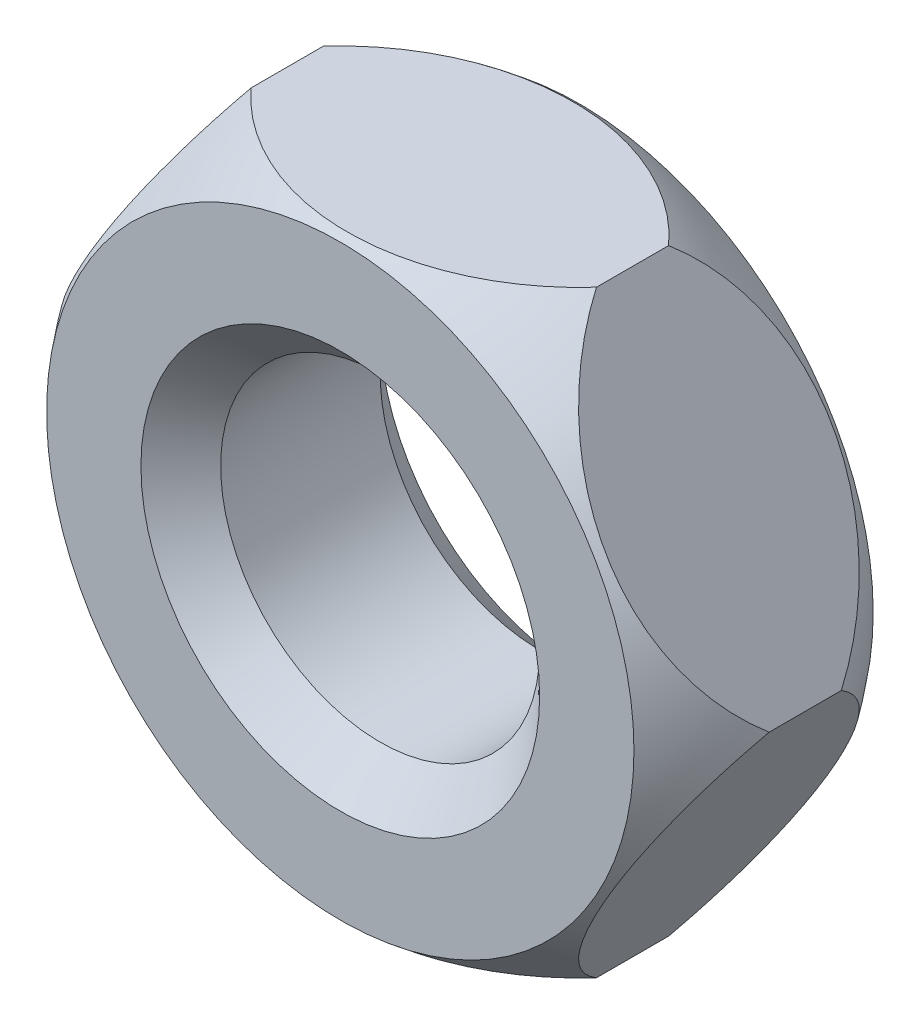
ISO-10303-21;
HEADER;
FILE_DESCRIPTION(('STEP AP214'),'2;1');
FILE_NAME('part.step','',(''),(''),'','','');
FILE_SCHEMA(('AUTOMOTIVE_DESIGN { 1 0 10303 214 1 1 1 1 }'));
ENDSEC;
DATA;
#1=APPLICATION_CONTEXT('core data for automotive mechanical design processes');
#2=APPLICATION_PROTOCOL_DEFINITION('international standard','automotive_design',2000,#1);
#3=PRODUCT_CONTEXT('',#1,'mechanical');
#4=PRODUCT('Part','Part','',(#3));
#5=PRODUCT_RELATED_PRODUCT_CATEGORY('part','',(#4));
#6=PRODUCT_DEFINITION_FORMATION('','',#4);
#7=PRODUCT_DEFINITION_CONTEXT('part definition',#1,'design');
#8=PRODUCT_DEFINITION('design','',#6,#7);
#9=PRODUCT_DEFINITION_SHAPE('','',#8);
#10=(LENGTH_UNIT() NAMED_UNIT(*) SI_UNIT(.MILLI.,.METRE.));
#11=(NAMED_UNIT(*) PLANE_ANGLE_UNIT() SI_UNIT($,.RADIAN.));
#12=(NAMED_UNIT(*) SI_UNIT($,.STERADIAN.) SOLID_ANGLE_UNIT());
#13=UNCERTAINTY_MEASURE_WITH_UNIT(LENGTH_MEASURE(1.E-05),#10,'distance_accuracy_value','');
#14=(GEOMETRIC_REPRESENTATION_CONTEXT(3) GLOBAL_UNCERTAINTY_ASSIGNED_CONTEXT((#13)) GLOBAL_UNIT_ASSIGNED_CONTEXT((#10,
#11,#12)) REPRESENTATION_CONTEXT('',''));
#15=CARTESIAN_POINT('',(0.,0.,0.));
#16=DIRECTION('',(0.,0.,1.));
#17=DIRECTION('',(1.,0.,0.));
#18=AXIS2_PLACEMENT_3D('',#15,#16,#17);
#19=CARTESIAN_POINT('',(0.,0.,0.));
#20=DIRECTION('',(0.,0.,1.));
#21=DIRECTION('',(1.,0.,0.));
#22=AXIS2_PLACEMENT_3D('',#19,#20,#21);
#23=PLANE('',#22);
#24=CARTESIAN_POINT('',(0.,0.,0.));
#25=DIRECTION('',(0.,0.,1.));
#26=DIRECTION('',(1.,0.,0.));
#27=AXIS2_PLACEMENT_3D('',#24,#25,#26);
#28=CIRCLE('',#27,2.5);
#29=CARTESIAN_POINT('',(2.5,0.,0.));
#30=VERTEX_POINT('',#29);
#31=EDGE_CURVE('E142',#30,#30,#28,.T.);
#32=ORIENTED_EDGE('',*,*,#31,.T.);
#33=EDGE_LOOP('',(#32));
#34=FACE_BOUND('',#33,.T.);
#35=CARTESIAN_POINT('',(0.,0.,0.));
#36=DIRECTION('',(0.,0.,1.));
#37=DIRECTION('',(1.,0.,0.));
#38=AXIS2_PLACEMENT_3D('',#35,#36,#37);
#39=CIRCLE('',#38,3.68272996566406);
#40=CARTESIAN_POINT('',(3.68272996566406,0.,0.));
#41=VERTEX_POINT('',#40);
#42=EDGE_CURVE('E167',#41,#41,#39,.F.);
#43=ORIENTED_EDGE('',*,*,#42,.T.);
#44=EDGE_LOOP('',(#43));
#45=FACE_BOUND('',#44,.T.);
#46=ADVANCED_FACE('F41',(#34,#45),#23,.F.);
#47=CARTESIAN_POINT('',(0.,0.,3.));
#48=DIRECTION('',(0.,0.,1.));
#49=DIRECTION('',(1.,0.,0.));
#50=AXIS2_PLACEMENT_3D('',#47,#48,#49);
#51=PLANE('',#50);
#52=CARTESIAN_POINT('',(0.,0.,3.));
#53=DIRECTION('',(0.,0.,1.));
#54=DIRECTION('',(1.,0.,0.));
#55=AXIS2_PLACEMENT_3D('',#52,#53,#54);
#56=CIRCLE('',#55,2.5);
#57=CARTESIAN_POINT('',(2.5,0.,3.));
#58=VERTEX_POINT('',#57);
#59=EDGE_CURVE('E11',#58,#58,#56,.F.);
#60=ORIENTED_EDGE('',*,*,#59,.T.);
#61=EDGE_LOOP('',(#60));
#62=FACE_BOUND('',#61,.T.);
#63=CARTESIAN_POINT('',(0.,0.,3.));
#64=DIRECTION('',(0.,0.,1.));
#65=DIRECTION('',(1.,0.,0.));
#66=AXIS2_PLACEMENT_3D('',#63,#64,#65);
#67=CIRCLE('',#66,3.68272996566406);
#68=CARTESIAN_POINT('',(3.68272996566406,0.,3.));
#69=VERTEX_POINT('',#68);
#70=EDGE_CURVE('E192',#69,#69,#67,.F.);
#71=ORIENTED_EDGE('',*,*,#70,.F.);
#72=EDGE_LOOP('',(#71));
#73=FACE_BOUND('',#72,.T.);
#74=ADVANCED_FACE('F163',(#62,#73),#51,.T.);
#75=CARTESIAN_POINT('',(2.1650635094611,-3.75,3.));
#76=DIRECTION('',(-0.866025403784439,0.5,0.));
#77=DIRECTION('',(-0.5,-0.866025403784439,0.));
#78=AXIS2_PLACEMENT_3D('',#75,#76,#77);
#79=PLANE('',#78);
#80=DIRECTION('',(0.,0.,-1.));
#81=VECTOR('',#80,1.);
#82=CARTESIAN_POINT('',(2.1650635094611,-3.75,3.));
#83=LINE('',#82,#81);
#84=CARTESIAN_POINT('',(2.16506350946109,-3.75,1.95256241897666));
#85=VERTEX_POINT('',#84);
#86=CARTESIAN_POINT('',(2.1650635094611,-3.75,1.04743758102334));
#87=VERTEX_POINT('',#86);
#88=EDGE_CURVE('E126',#85,#87,#83,.T.);
#89=ORIENTED_EDGE('',*,*,#88,.T.);
#90=CARTESIAN_POINT('',(3.24759526419165,-1.875,3.));
#91=DIRECTION('',(-0.866025403784439,0.5,0.));
#92=DIRECTION('',(-0.5,-0.866025403784439,0.));
#93=AXIS2_PLACEMENT_3D('',#90,#91,#92);
#94=CIRCLE('',#93,2.91547594742265);
#95=CARTESIAN_POINT('',(4.33012701892219,0.,1.04743758102334));
#96=VERTEX_POINT('',#95);
#97=EDGE_CURVE('E58',#87,#96,#94,.F.);
#98=ORIENTED_EDGE('',*,*,#97,.T.);
#99=DIRECTION('',(0.,0.,-1.));
#100=VECTOR('',#99,1.);
#101=CARTESIAN_POINT('',(4.33012701892219,0.,3.));
#102=LINE('',#101,#100);
#103=CARTESIAN_POINT('',(4.33012701892219,0.,1.95256241897666));
#104=VERTEX_POINT('',#103);
#105=EDGE_CURVE('E133',#104,#96,#102,.T.);
#106=ORIENTED_EDGE('',*,*,#105,.F.);
#107=CARTESIAN_POINT('',(3.24759526419165,-1.875,0.));
#108=DIRECTION('',(-0.866025403784439,0.5,0.));
#109=DIRECTION('',(-0.5,-0.866025403784439,0.));
#110=AXIS2_PLACEMENT_3D('',#107,#108,#109);
#111=CIRCLE('',#110,2.91547594742265);
#112=EDGE_CURVE('E188',#104,#85,#111,.F.);
#113=ORIENTED_EDGE('',*,*,#112,.T.);
#114=EDGE_LOOP('',(#89,#98,#106,#113));
#115=FACE_BOUND('',#114,.T.);
#116=ADVANCED_FACE('F199',(#115),#79,.F.);
#117=CARTESIAN_POINT('',(4.33012701892219,0.,3.));
#118=DIRECTION('',(-0.866025403784439,-0.5,0.));
#119=DIRECTION('',(0.5,-0.866025403784439,0.));
#120=AXIS2_PLACEMENT_3D('',#117,#118,#119);
#121=PLANE('',#120);
#122=ORIENTED_EDGE('',*,*,#105,.T.);
#123=CARTESIAN_POINT('',(3.24759526419165,1.875,3.));
#124=DIRECTION('',(-0.866025403784439,-0.5,0.));
#125=DIRECTION('',(0.5,-0.866025403784439,0.));
#126=AXIS2_PLACEMENT_3D('',#123,#124,#125);
#127=CIRCLE('',#126,2.91547594742265);
#128=CARTESIAN_POINT('',(2.16506350946109,3.75,1.04743758102334));
#129=VERTEX_POINT('',#128);
#130=EDGE_CURVE('E174',#96,#129,#127,.F.);
#131=ORIENTED_EDGE('',*,*,#130,.T.);
#132=DIRECTION('',(0.,0.,-1.));
#133=VECTOR('',#132,1.);
#134=CARTESIAN_POINT('',(2.1650635094611,3.75,3.));
#135=LINE('',#134,#133);
#136=CARTESIAN_POINT('',(2.16506350946109,3.75,1.95256241897666));
#137=VERTEX_POINT('',#136);
#138=EDGE_CURVE('E124',#137,#129,#135,.T.);
#139=ORIENTED_EDGE('',*,*,#138,.F.);
#140=CARTESIAN_POINT('',(3.24759526419165,1.875,0.));
#141=DIRECTION('',(-0.866025403784439,-0.5,0.));
#142=DIRECTION('',(0.5,-0.866025403784439,0.));
#143=AXIS2_PLACEMENT_3D('',#140,#141,#142);
#144=CIRCLE('',#143,2.91547594742265);
#145=EDGE_CURVE('E184',#137,#104,#144,.F.);
#146=ORIENTED_EDGE('',*,*,#145,.T.);
#147=EDGE_LOOP('',(#122,#131,#139,#146));
#148=FACE_BOUND('',#147,.T.);
#149=ADVANCED_FACE('F206',(#148),#121,.F.);
#150=CARTESIAN_POINT('',(2.1650635094611,3.75,3.));
#151=DIRECTION('',(0.,-1.,0.));
#152=DIRECTION('',(0.,0.,-1.));
#153=AXIS2_PLACEMENT_3D('',#150,#151,#152);
#154=PLANE('',#153);
#155=ORIENTED_EDGE('',*,*,#138,.T.);
#156=CARTESIAN_POINT('',(0.,3.75,3.));
#157=DIRECTION('',(0.,-1.,0.));
#158=DIRECTION('',(0.,0.,-1.));
#159=AXIS2_PLACEMENT_3D('',#156,#157,#158);
#160=CIRCLE('',#159,2.91547594742265);
#161=CARTESIAN_POINT('',(-2.1650635094611,3.75,1.04743758102334));
#162=VERTEX_POINT('',#161);
#163=EDGE_CURVE('E116',#129,#162,#160,.F.);
#164=ORIENTED_EDGE('',*,*,#163,.T.);
#165=DIRECTION('',(0.,0.,-1.));
#166=VECTOR('',#165,1.);
#167=CARTESIAN_POINT('',(-2.1650635094611,3.75,3.));
#168=LINE('',#167,#166);
#169=CARTESIAN_POINT('',(-2.1650635094611,3.75,1.95256241897666));
#170=VERTEX_POINT('',#169);
#171=EDGE_CURVE('E114',#170,#162,#168,.T.);
#172=ORIENTED_EDGE('',*,*,#171,.F.);
#173=CARTESIAN_POINT('',(0.,3.75,0.));
#174=DIRECTION('',(0.,-1.,0.));
#175=DIRECTION('',(0.,0.,-1.));
#176=AXIS2_PLACEMENT_3D('',#173,#174,#175);
#177=CIRCLE('',#176,2.91547594742265);
#178=EDGE_CURVE('E180',#170,#137,#177,.F.);
#179=ORIENTED_EDGE('',*,*,#178,.T.);
#180=EDGE_LOOP('',(#155,#164,#172,#179));
#181=FACE_BOUND('',#180,.T.);
#182=ADVANCED_FACE('F209',(#181),#154,.F.);
#183=CARTESIAN_POINT('',(-2.1650635094611,3.75,3.));
#184=DIRECTION('',(0.866025403784439,-0.5,0.));
#185=DIRECTION('',(0.5,0.866025403784439,0.));
#186=AXIS2_PLACEMENT_3D('',#183,#184,#185);
#187=PLANE('',#186);
#188=ORIENTED_EDGE('',*,*,#171,.T.);
#189=CARTESIAN_POINT('',(-3.24759526419165,1.875,3.));
#190=DIRECTION('',(0.866025403784439,-0.5,0.));
#191=DIRECTION('',(0.5,0.866025403784439,0.));
#192=AXIS2_PLACEMENT_3D('',#189,#190,#191);
#193=CIRCLE('',#192,2.91547594742265);
#194=CARTESIAN_POINT('',(-4.3301270189222,0.,1.04743758102334));
#195=VERTEX_POINT('',#194);
#196=EDGE_CURVE('E98',#162,#195,#193,.F.);
#197=ORIENTED_EDGE('',*,*,#196,.T.);
#198=DIRECTION('',(0.,0.,-1.));
#199=VECTOR('',#198,1.);
#200=CARTESIAN_POINT('',(-4.3301270189222,0.,3.));
#201=LINE('',#200,#199);
#202=CARTESIAN_POINT('',(-4.3301270189222,0.,1.95256241897666));
#203=VERTEX_POINT('',#202);
#204=EDGE_CURVE('E112',#203,#195,#201,.T.);
#205=ORIENTED_EDGE('',*,*,#204,.F.);
#206=CARTESIAN_POINT('',(-3.24759526419165,1.875,0.));
#207=DIRECTION('',(0.866025403784439,-0.5,0.));
#208=DIRECTION('',(0.5,0.866025403784439,0.));
#209=AXIS2_PLACEMENT_3D('',#206,#207,#208);
#210=CIRCLE('',#209,2.91547594742265);
#211=EDGE_CURVE('E172',#203,#170,#210,.F.);
#212=ORIENTED_EDGE('',*,*,#211,.T.);
#213=EDGE_LOOP('',(#188,#197,#205,#212));
#214=FACE_BOUND('',#213,.T.);
#215=ADVANCED_FACE('F110',(#214),#187,.F.);
#216=CARTESIAN_POINT('',(-4.3301270189222,0.,3.));
#217=DIRECTION('',(0.866025403784439,0.5,0.));
#218=DIRECTION('',(-0.5,0.866025403784439,0.));
#219=AXIS2_PLACEMENT_3D('',#216,#217,#218);
#220=PLANE('',#219);
#221=ORIENTED_EDGE('',*,*,#204,.T.);
#222=CARTESIAN_POINT('',(-3.24759526419165,-1.875,3.));
#223=DIRECTION('',(0.866025403784439,0.5,0.));
#224=DIRECTION('',(-0.5,0.866025403784439,0.));
#225=AXIS2_PLACEMENT_3D('',#222,#223,#224);
#226=CIRCLE('',#225,2.91547594742265);
#227=CARTESIAN_POINT('',(-2.1650635094611,-3.75,1.04743758102334));
#228=VERTEX_POINT('',#227);
#229=EDGE_CURVE('E94',#195,#228,#226,.F.);
#230=ORIENTED_EDGE('',*,*,#229,.T.);
#231=DIRECTION('',(0.,0.,-1.));
#232=VECTOR('',#231,1.);
#233=CARTESIAN_POINT('',(-2.1650635094611,-3.75,3.));
#234=LINE('',#233,#232);
#235=CARTESIAN_POINT('',(-2.1650635094611,-3.75,1.95256241897666));
#236=VERTEX_POINT('',#235);
#237=EDGE_CURVE('E120',#236,#228,#234,.T.);
#238=ORIENTED_EDGE('',*,*,#237,.F.);
#239=CARTESIAN_POINT('',(-3.24759526419165,-1.875,0.));
#240=DIRECTION('',(0.866025403784439,0.5,0.));
#241=DIRECTION('',(-0.5,0.866025403784439,0.));
#242=AXIS2_PLACEMENT_3D('',#239,#240,#241);
#243=CIRCLE('',#242,2.91547594742265);
#244=EDGE_CURVE('E66',#236,#203,#243,.F.);
#245=ORIENTED_EDGE('',*,*,#244,.T.);
#246=EDGE_LOOP('',(#221,#230,#238,#245));
#247=FACE_BOUND('',#246,.T.);
#248=ADVANCED_FACE('F118',(#247),#220,.F.);
#249=CARTESIAN_POINT('',(-2.1650635094611,-3.75,3.));
#250=DIRECTION('',(0.,1.,0.));
#251=DIRECTION('',(-1.,0.,0.));
#252=AXIS2_PLACEMENT_3D('',#249,#250,#251);
#253=PLANE('',#252);
#254=ORIENTED_EDGE('',*,*,#237,.T.);
#255=CARTESIAN_POINT('',(0.,-3.75,3.));
#256=DIRECTION('',(0.,1.,0.));
#257=DIRECTION('',(-1.,0.,0.));
#258=AXIS2_PLACEMENT_3D('',#255,#256,#257);
#259=CIRCLE('',#258,2.91547594742265);
#260=EDGE_CURVE('E100',#228,#87,#259,.F.);
#261=ORIENTED_EDGE('',*,*,#260,.T.);
#262=ORIENTED_EDGE('',*,*,#88,.F.);
#263=CARTESIAN_POINT('',(0.,-3.75,0.));
#264=DIRECTION('',(0.,1.,0.));
#265=DIRECTION('',(-1.,0.,0.));
#266=AXIS2_PLACEMENT_3D('',#263,#264,#265);
#267=CIRCLE('',#266,2.91547594742265);
#268=EDGE_CURVE('E137',#85,#236,#267,.F.);
#269=ORIENTED_EDGE('',*,*,#268,.T.);
#270=EDGE_LOOP('',(#254,#261,#262,#269));
#271=FACE_BOUND('',#270,.T.);
#272=ADVANCED_FACE('F202',(#271),#253,.F.);
#273=CARTESIAN_POINT('',(0.,0.,3.));
#274=DIRECTION('',(0.,0.,-1.));
#275=DIRECTION('',(-1.,0.,0.));
#276=AXIS2_PLACEMENT_3D('',#273,#274,#275);
#277=CYLINDRICAL_SURFACE('',#276,2.);
#278=CARTESIAN_POINT('',(0.,0.,0.500000000000004));
#279=DIRECTION('',(0.,0.,1.));
#280=DIRECTION('',(1.,0.,0.));
#281=AXIS2_PLACEMENT_3D('',#278,#279,#280);
#282=CIRCLE('',#281,2.);
#283=CARTESIAN_POINT('',(2.,0.,0.500000000000004));
#284=VERTEX_POINT('',#283);
#285=EDGE_CURVE('E51',#284,#284,#282,.F.);
#286=ORIENTED_EDGE('',*,*,#285,.T.);
#287=EDGE_LOOP('',(#286));
#288=FACE_BOUND('',#287,.T.);
#289=CARTESIAN_POINT('',(0.,0.,2.5));
#290=DIRECTION('',(0.,0.,1.));
#291=DIRECTION('',(1.,0.,0.));
#292=AXIS2_PLACEMENT_3D('',#289,#290,#291);
#293=CIRCLE('',#292,2.);
#294=CARTESIAN_POINT('',(2.,0.,2.5));
#295=VERTEX_POINT('',#294);
#296=EDGE_CURVE('E146',#295,#295,#293,.T.);
#297=ORIENTED_EDGE('',*,*,#296,.T.);
#298=EDGE_LOOP('',(#297));
#299=FACE_BOUND('',#298,.T.);
#300=ADVANCED_FACE('F153',(#288,#299),#277,.F.);
#301=CARTESIAN_POINT('',(0.,0.,0.));
#302=DIRECTION('',(0.,0.,-1.));
#303=DIRECTION('',(-1.,0.,0.));
#304=AXIS2_PLACEMENT_3D('',#301,#302,#303);
#305=SPHERICAL_SURFACE('',#304,4.75);
#306=ORIENTED_EDGE('',*,*,#70,.T.);
#307=EDGE_LOOP('',(#306));
#308=FACE_BOUND('',#307,.T.);
#309=ORIENTED_EDGE('',*,*,#145,.F.);
#310=ORIENTED_EDGE('',*,*,#178,.F.);
#311=ORIENTED_EDGE('',*,*,#211,.F.);
#312=ORIENTED_EDGE('',*,*,#244,.F.);
#313=ORIENTED_EDGE('',*,*,#268,.F.);
#314=ORIENTED_EDGE('',*,*,#112,.F.);
#315=EDGE_LOOP('',(#309,#310,#311,#312,#313,#314));
#316=FACE_BOUND('',#315,.T.);
#317=ADVANCED_FACE('F203',(#308,#316),#305,.T.);
#318=CARTESIAN_POINT('',(0.,0.,3.));
#319=DIRECTION('',(0.,0.,1.));
#320=DIRECTION('',(-1.,0.,0.));
#321=AXIS2_PLACEMENT_3D('',#318,#319,#320);
#322=SPHERICAL_SURFACE('',#321,4.75);
#323=ORIENTED_EDGE('',*,*,#260,.F.);
#324=ORIENTED_EDGE('',*,*,#229,.F.);
#325=ORIENTED_EDGE('',*,*,#196,.F.);
#326=ORIENTED_EDGE('',*,*,#163,.F.);
#327=ORIENTED_EDGE('',*,*,#130,.F.);
#328=ORIENTED_EDGE('',*,*,#97,.F.);
#329=EDGE_LOOP('',(#323,#324,#325,#326,#327,#328));
#330=FACE_BOUND('',#329,.T.);
#331=ORIENTED_EDGE('',*,*,#42,.F.);
#332=EDGE_LOOP('',(#331));
#333=FACE_BOUND('',#332,.T.);
#334=ADVANCED_FACE('F96',(#330,#333),#322,.T.);
#335=CARTESIAN_POINT('',(0.,0.,0.));
#336=DIRECTION('',(0.,0.,-1.));
#337=DIRECTION('',(-1.,0.,0.));
#338=AXIS2_PLACEMENT_3D('',#335,#336,#337);
#339=CONICAL_SURFACE('',#338,2.5,0.785398163397446);
#340=ORIENTED_EDGE('',*,*,#285,.F.);
#341=EDGE_LOOP('',(#340));
#342=FACE_BOUND('',#341,.T.);
#343=ORIENTED_EDGE('',*,*,#31,.F.);
#344=EDGE_LOOP('',(#343));
#345=FACE_BOUND('',#344,.T.);
#346=ADVANCED_FACE('F156',(#342,#345),#339,.F.);
#347=CARTESIAN_POINT('',(0.,0.,2.5));
#348=DIRECTION('',(0.,0.,1.));
#349=DIRECTION('',(1.,0.,0.));
#350=AXIS2_PLACEMENT_3D('',#347,#348,#349);
#351=CONICAL_SURFACE('',#350,2.,0.785398163397448);
#352=ORIENTED_EDGE('',*,*,#59,.F.);
#353=EDGE_LOOP('',(#352));
#354=FACE_BOUND('',#353,.T.);
#355=ORIENTED_EDGE('',*,*,#296,.F.);
#356=EDGE_LOOP('',(#355));
#357=FACE_BOUND('',#356,.T.);
#358=ADVANCED_FACE('F44',(#354,#357),#351,.F.);
#359=CLOSED_SHELL('',(#46,#74,#116,#149,#182,#215,#248,#272,#300,#317,#334,#346,#358));
#360=MANIFOLD_SOLID_BREP('B2',#359);
#361=ADVANCED_BREP_SHAPE_REPRESENTATION('',(#18,#360),#14);
#362=SHAPE_DEFINITION_REPRESENTATION(#9,#361);
ENDSEC;
END-ISO-10303-21;
